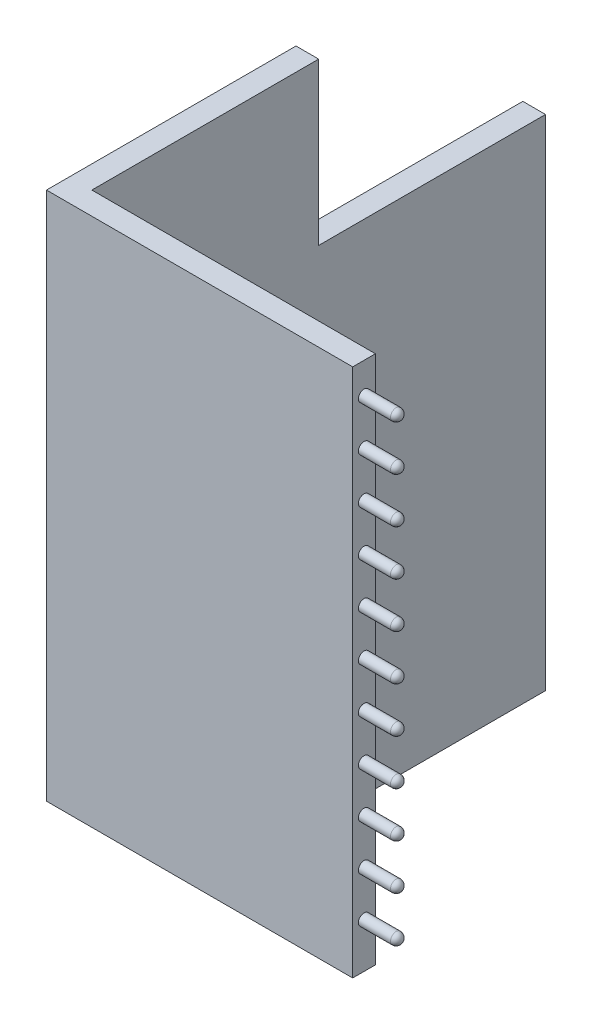
ISO-10303-21;
HEADER;
FILE_DESCRIPTION(('STEP AP214'),'2;1');
FILE_NAME('part.step','',(''),(''),'','','');
FILE_SCHEMA(('AUTOMOTIVE_DESIGN { 1 0 10303 214 1 1 1 1 }'));
ENDSEC;
DATA;
#1=APPLICATION_CONTEXT('core data for automotive mechanical design processes');
#2=APPLICATION_PROTOCOL_DEFINITION('international standard','automotive_design',2000,#1);
#3=PRODUCT_CONTEXT('',#1,'mechanical');
#4=PRODUCT('Part','Part','',(#3));
#5=PRODUCT_RELATED_PRODUCT_CATEGORY('part','',(#4));
#6=PRODUCT_DEFINITION_FORMATION('','',#4);
#7=PRODUCT_DEFINITION_CONTEXT('part definition',#1,'design');
#8=PRODUCT_DEFINITION('design','',#6,#7);
#9=PRODUCT_DEFINITION_SHAPE('','',#8);
#10=(LENGTH_UNIT() NAMED_UNIT(*) SI_UNIT(.MILLI.,.METRE.));
#11=(NAMED_UNIT(*) PLANE_ANGLE_UNIT() SI_UNIT($,.RADIAN.));
#12=(NAMED_UNIT(*) SI_UNIT($,.STERADIAN.) SOLID_ANGLE_UNIT());
#13=UNCERTAINTY_MEASURE_WITH_UNIT(LENGTH_MEASURE(1.E-05),#10,'distance_accuracy_value','');
#14=(GEOMETRIC_REPRESENTATION_CONTEXT(3) GLOBAL_UNCERTAINTY_ASSIGNED_CONTEXT((#13)) GLOBAL_UNIT_ASSIGNED_CONTEXT((#10,
#11,#12)) REPRESENTATION_CONTEXT('',''));
#15=CARTESIAN_POINT('',(0.,0.,0.));
#16=DIRECTION('',(0.,0.,1.));
#17=DIRECTION('',(1.,0.,0.));
#18=AXIS2_PLACEMENT_3D('',#15,#16,#17);
#19=CARTESIAN_POINT('',(0.,0.,-30.));
#20=DIRECTION('',(0.,0.,1.));
#21=DIRECTION('',(1.,0.,0.));
#22=AXIS2_PLACEMENT_3D('',#19,#20,#21);
#23=PLANE('',#22);
#24=DIRECTION('',(1.,0.,0.));
#25=VECTOR('',#24,1.);
#26=CARTESIAN_POINT('',(-20.25,13.66,-30.));
#27=LINE('',#26,#25);
#28=CARTESIAN_POINT('',(-20.25,13.66,-30.));
#29=VERTEX_POINT('',#28);
#30=CARTESIAN_POINT('',(-17.25,13.66,-30.));
#31=VERTEX_POINT('',#30);
#32=EDGE_CURVE('E63',#29,#31,#27,.T.);
#33=ORIENTED_EDGE('',*,*,#32,.F.);
#34=DIRECTION('',(0.,1.,0.));
#35=VECTOR('',#34,1.);
#36=CARTESIAN_POINT('',(-20.25,35.,-30.));
#37=LINE('',#36,#35);
#38=CARTESIAN_POINT('',(-20.25,35.,-30.));
#39=VERTEX_POINT('',#38);
#40=EDGE_CURVE('E190',#29,#39,#37,.T.);
#41=ORIENTED_EDGE('',*,*,#40,.T.);
#42=DIRECTION('',(1.,0.,0.));
#43=VECTOR('',#42,1.);
#44=CARTESIAN_POINT('',(-20.25,35.,-30.));
#45=LINE('',#44,#43);
#46=CARTESIAN_POINT('',(-17.25,35.,-30.));
#47=VERTEX_POINT('',#46);
#48=EDGE_CURVE('E193',#39,#47,#45,.T.);
#49=ORIENTED_EDGE('',*,*,#48,.T.);
#50=DIRECTION('',(0.,-1.,0.));
#51=VECTOR('',#50,1.);
#52=CARTESIAN_POINT('',(-17.25,35.,-30.));
#53=LINE('',#52,#51);
#54=EDGE_CURVE('E196',#47,#31,#53,.T.);
#55=ORIENTED_EDGE('',*,*,#54,.T.);
#56=EDGE_LOOP('',(#33,#41,#49,#55));
#57=FACE_BOUND('',#56,.T.);
#58=ADVANCED_FACE('F47',(#57),#23,.F.);
#59=CARTESIAN_POINT('',(-20.25,35.,3.));
#60=DIRECTION('',(1.,0.,0.));
#61=DIRECTION('',(0.,1.,0.));
#62=AXIS2_PLACEMENT_3D('',#59,#60,#61);
#63=PLANE('',#62);
#64=DIRECTION('',(0.,0.,-1.));
#65=VECTOR('',#64,1.);
#66=CARTESIAN_POINT('',(-20.25,35.,3.));
#67=LINE('',#66,#65);
#68=CARTESIAN_POINT('',(-20.25,35.,3.));
#69=VERTEX_POINT('',#68);
#70=EDGE_CURVE('E226',#69,#39,#67,.T.);
#71=ORIENTED_EDGE('',*,*,#70,.T.);
#72=ORIENTED_EDGE('',*,*,#40,.F.);
#73=DIRECTION('',(0.,0.,1.));
#74=VECTOR('',#73,1.);
#75=CARTESIAN_POINT('',(-20.25,13.66,-30.));
#76=LINE('',#75,#74);
#77=CARTESIAN_POINT('',(-20.25,13.66,-60.));
#78=VERTEX_POINT('',#77);
#79=EDGE_CURVE('E149',#78,#29,#76,.T.);
#80=ORIENTED_EDGE('',*,*,#79,.F.);
#81=DIRECTION('',(0.,1.,0.));
#82=VECTOR('',#81,1.);
#83=CARTESIAN_POINT('',(-20.25,13.66,-60.));
#84=LINE('',#83,#82);
#85=CARTESIAN_POINT('',(-20.25,-52.34,-60.));
#86=VERTEX_POINT('',#85);
#87=EDGE_CURVE('E156',#86,#78,#84,.T.);
#88=ORIENTED_EDGE('',*,*,#87,.F.);
#89=DIRECTION('',(0.,0.,-1.));
#90=VECTOR('',#89,1.);
#91=CARTESIAN_POINT('',(-20.25,-52.34,-30.));
#92=LINE('',#91,#90);
#93=CARTESIAN_POINT('',(-20.25,-52.34,-30.));
#94=VERTEX_POINT('',#93);
#95=EDGE_CURVE('E139',#94,#86,#92,.T.);
#96=ORIENTED_EDGE('',*,*,#95,.F.);
#97=DIRECTION('',(0.,-1.,0.));
#98=VECTOR('',#97,1.);
#99=CARTESIAN_POINT('',(-20.25,13.66,-30.));
#100=LINE('',#99,#98);
#101=CARTESIAN_POINT('',(-20.25,-35.,-30.));
#102=VERTEX_POINT('',#101);
#103=EDGE_CURVE('E127',#102,#94,#100,.T.);
#104=ORIENTED_EDGE('',*,*,#103,.F.);
#105=DIRECTION('',(0.,0.,-1.));
#106=VECTOR('',#105,1.);
#107=CARTESIAN_POINT('',(-20.25,-35.,3.));
#108=LINE('',#107,#106);
#109=CARTESIAN_POINT('',(-20.25,-35.,3.));
#110=VERTEX_POINT('',#109);
#111=EDGE_CURVE('E244',#110,#102,#108,.T.);
#112=ORIENTED_EDGE('',*,*,#111,.F.);
#113=DIRECTION('',(0.,-1.,0.));
#114=VECTOR('',#113,1.);
#115=CARTESIAN_POINT('',(-20.25,35.,3.));
#116=LINE('',#115,#114);
#117=EDGE_CURVE('E212',#69,#110,#116,.T.);
#118=ORIENTED_EDGE('',*,*,#117,.F.);
#119=EDGE_LOOP('',(#71,#72,#80,#88,#96,#104,#112,#118));
#120=FACE_BOUND('',#119,.T.);
#121=ADVANCED_FACE('F153',(#120),#63,.F.);
#122=CARTESIAN_POINT('',(20.25,-35.,3.));
#123=DIRECTION('',(0.,1.,0.));
#124=DIRECTION('',(-1.,0.,0.));
#125=AXIS2_PLACEMENT_3D('',#122,#123,#124);
#126=PLANE('',#125);
#127=ORIENTED_EDGE('',*,*,#111,.T.);
#128=DIRECTION('',(-1.,0.,0.));
#129=VECTOR('',#128,1.);
#130=CARTESIAN_POINT('',(-20.25,-35.,-30.));
#131=LINE('',#130,#129);
#132=CARTESIAN_POINT('',(-17.25,-35.,-30.));
#133=VERTEX_POINT('',#132);
#134=EDGE_CURVE('E134',#133,#102,#131,.T.);
#135=ORIENTED_EDGE('',*,*,#134,.F.);
#136=DIRECTION('',(0.,0.,1.));
#137=VECTOR('',#136,1.);
#138=CARTESIAN_POINT('',(-17.25,-35.,-30.));
#139=LINE('',#138,#137);
#140=CARTESIAN_POINT('',(-17.25,-35.,0.));
#141=VERTEX_POINT('',#140);
#142=EDGE_CURVE('E201',#133,#141,#139,.T.);
#143=ORIENTED_EDGE('',*,*,#142,.T.);
#144=DIRECTION('',(1.,0.,0.));
#145=VECTOR('',#144,1.);
#146=CARTESIAN_POINT('',(20.25,-35.,0.));
#147=LINE('',#146,#145);
#148=CARTESIAN_POINT('',(20.25,-35.,0.));
#149=VERTEX_POINT('',#148);
#150=EDGE_CURVE('E211',#141,#149,#147,.T.);
#151=ORIENTED_EDGE('',*,*,#150,.T.);
#152=DIRECTION('',(0.,0.,-1.));
#153=VECTOR('',#152,1.);
#154=CARTESIAN_POINT('',(20.25,-35.,3.));
#155=LINE('',#154,#153);
#156=CARTESIAN_POINT('',(20.25,-35.,3.));
#157=VERTEX_POINT('',#156);
#158=EDGE_CURVE('E240',#157,#149,#155,.T.);
#159=ORIENTED_EDGE('',*,*,#158,.F.);
#160=DIRECTION('',(1.,0.,0.));
#161=VECTOR('',#160,1.);
#162=CARTESIAN_POINT('',(20.25,-35.,3.));
#163=LINE('',#162,#161);
#164=EDGE_CURVE('E216',#110,#157,#163,.T.);
#165=ORIENTED_EDGE('',*,*,#164,.F.);
#166=EDGE_LOOP('',(#127,#135,#143,#151,#159,#165));
#167=FACE_BOUND('',#166,.T.);
#168=ADVANCED_FACE('F343',(#167),#126,.F.);
#169=CARTESIAN_POINT('',(20.25,35.,3.));
#170=DIRECTION('',(-1.,0.,0.));
#171=DIRECTION('',(0.,-1.,0.));
#172=AXIS2_PLACEMENT_3D('',#169,#170,#171);
#173=PLANE('',#172);
#174=CARTESIAN_POINT('',(20.25,-5.04310615896624,1.49999999999963));
#175=DIRECTION('',(1.,0.,0.));
#176=DIRECTION('',(0.,1.,0.));
#177=AXIS2_PLACEMENT_3D('',#174,#175,#176);
#178=CIRCLE('',#177,0.75);
#179=CARTESIAN_POINT('',(20.25,-4.29310615896624,1.49999999999963));
#180=VERTEX_POINT('',#179);
#181=EDGE_CURVE('E184',#180,#180,#178,.T.);
#182=ORIENTED_EDGE('',*,*,#181,.F.);
#183=EDGE_LOOP('',(#182));
#184=FACE_BOUND('',#183,.T.);
#185=CARTESIAN_POINT('',(20.25,30.9568938410338,1.5));
#186=DIRECTION('',(-1.,0.,0.));
#187=DIRECTION('',(0.,-1.,0.));
#188=AXIS2_PLACEMENT_3D('',#185,#186,#187);
#189=CIRCLE('',#188,0.75);
#190=CARTESIAN_POINT('',(20.25,30.2068938410338,1.5));
#191=VERTEX_POINT('',#190);
#192=EDGE_CURVE('E189',#191,#191,#189,.F.);
#193=ORIENTED_EDGE('',*,*,#192,.F.);
#194=EDGE_LOOP('',(#193));
#195=FACE_BOUND('',#194,.T.);
#196=CARTESIAN_POINT('',(20.25,24.9568938410338,1.49999999999994));
#197=DIRECTION('',(-1.,0.,0.));
#198=DIRECTION('',(0.,-1.,0.));
#199=AXIS2_PLACEMENT_3D('',#196,#197,#198);
#200=CIRCLE('',#199,0.75);
#201=CARTESIAN_POINT('',(20.25,24.2068938410338,1.49999999999994));
#202=VERTEX_POINT('',#201);
#203=EDGE_CURVE('E279',#202,#202,#200,.F.);
#204=ORIENTED_EDGE('',*,*,#203,.F.);
#205=EDGE_LOOP('',(#204));
#206=FACE_BOUND('',#205,.T.);
#207=CARTESIAN_POINT('',(20.25,18.9568938410338,1.49999999999988));
#208=DIRECTION('',(-1.,0.,0.));
#209=DIRECTION('',(0.,-1.,0.));
#210=AXIS2_PLACEMENT_3D('',#207,#208,#209);
#211=CIRCLE('',#210,0.75);
#212=CARTESIAN_POINT('',(20.25,18.2068938410338,1.49999999999988));
#213=VERTEX_POINT('',#212);
#214=EDGE_CURVE('E275',#213,#213,#211,.F.);
#215=ORIENTED_EDGE('',*,*,#214,.F.);
#216=EDGE_LOOP('',(#215));
#217=FACE_BOUND('',#216,.T.);
#218=CARTESIAN_POINT('',(20.25,12.9568938410338,1.49999999999981));
#219=DIRECTION('',(-1.,0.,0.));
#220=DIRECTION('',(0.,-1.,0.));
#221=AXIS2_PLACEMENT_3D('',#218,#219,#220);
#222=CIRCLE('',#221,0.75);
#223=CARTESIAN_POINT('',(20.25,12.2068938410338,1.49999999999981));
#224=VERTEX_POINT('',#223);
#225=EDGE_CURVE('E271',#224,#224,#222,.F.);
#226=ORIENTED_EDGE('',*,*,#225,.F.);
#227=EDGE_LOOP('',(#226));
#228=FACE_BOUND('',#227,.T.);
#229=CARTESIAN_POINT('',(20.25,6.95689384103377,1.49999999999975));
#230=DIRECTION('',(-1.,0.,0.));
#231=DIRECTION('',(0.,-1.,0.));
#232=AXIS2_PLACEMENT_3D('',#229,#230,#231);
#233=CIRCLE('',#232,0.75);
#234=CARTESIAN_POINT('',(20.25,6.20689384103377,1.49999999999975));
#235=VERTEX_POINT('',#234);
#236=EDGE_CURVE('E267',#235,#235,#233,.F.);
#237=ORIENTED_EDGE('',*,*,#236,.F.);
#238=EDGE_LOOP('',(#237));
#239=FACE_BOUND('',#238,.T.);
#240=CARTESIAN_POINT('',(20.25,0.956893841033769,1.49999999999969));
#241=DIRECTION('',(-1.,0.,0.));
#242=DIRECTION('',(0.,-1.,0.));
#243=AXIS2_PLACEMENT_3D('',#240,#241,#242);
#244=CIRCLE('',#243,0.75);
#245=CARTESIAN_POINT('',(20.25,0.206893841033769,1.49999999999969));
#246=VERTEX_POINT('',#245);
#247=EDGE_CURVE('E263',#246,#246,#244,.F.);
#248=ORIENTED_EDGE('',*,*,#247,.F.);
#249=EDGE_LOOP('',(#248));
#250=FACE_BOUND('',#249,.T.);
#251=CARTESIAN_POINT('',(20.25,-11.0431061589662,1.49999999999956));
#252=DIRECTION('',(-1.,0.,0.));
#253=DIRECTION('',(0.,-1.,0.));
#254=AXIS2_PLACEMENT_3D('',#251,#252,#253);
#255=CIRCLE('',#254,0.75);
#256=CARTESIAN_POINT('',(20.25,-11.7931061589662,1.49999999999956));
#257=VERTEX_POINT('',#256);
#258=EDGE_CURVE('E259',#257,#257,#255,.F.);
#259=ORIENTED_EDGE('',*,*,#258,.F.);
#260=EDGE_LOOP('',(#259));
#261=FACE_BOUND('',#260,.T.);
#262=CARTESIAN_POINT('',(20.25,-17.0431061589662,1.4999999999995));
#263=DIRECTION('',(-1.,0.,0.));
#264=DIRECTION('',(0.,-1.,0.));
#265=AXIS2_PLACEMENT_3D('',#262,#263,#264);
#266=CIRCLE('',#265,0.75);
#267=CARTESIAN_POINT('',(20.25,-17.7931061589662,1.4999999999995));
#268=VERTEX_POINT('',#267);
#269=EDGE_CURVE('E255',#268,#268,#266,.F.);
#270=ORIENTED_EDGE('',*,*,#269,.F.);
#271=EDGE_LOOP('',(#270));
#272=FACE_BOUND('',#271,.T.);
#273=CARTESIAN_POINT('',(20.25,-23.0431061589662,1.49999999999944));
#274=DIRECTION('',(-1.,0.,0.));
#275=DIRECTION('',(0.,-1.,0.));
#276=AXIS2_PLACEMENT_3D('',#273,#274,#275);
#277=CIRCLE('',#276,0.75);
#278=CARTESIAN_POINT('',(20.25,-23.7931061589662,1.49999999999944));
#279=VERTEX_POINT('',#278);
#280=EDGE_CURVE('E251',#279,#279,#277,.F.);
#281=ORIENTED_EDGE('',*,*,#280,.F.);
#282=EDGE_LOOP('',(#281));
#283=FACE_BOUND('',#282,.T.);
#284=CARTESIAN_POINT('',(20.25,-29.0431061589662,1.49999999999938));
#285=DIRECTION('',(-1.,0.,0.));
#286=DIRECTION('',(0.,-1.,0.));
#287=AXIS2_PLACEMENT_3D('',#284,#285,#286);
#288=CIRCLE('',#287,0.75);
#289=CARTESIAN_POINT('',(20.25,-29.7931061589662,1.49999999999938));
#290=VERTEX_POINT('',#289);
#291=EDGE_CURVE('E247',#290,#290,#288,.F.);
#292=ORIENTED_EDGE('',*,*,#291,.F.);
#293=EDGE_LOOP('',(#292));
#294=FACE_BOUND('',#293,.T.);
#295=DIRECTION('',(0.,1.,0.));
#296=VECTOR('',#295,1.);
#297=CARTESIAN_POINT('',(20.25,35.,0.));
#298=LINE('',#297,#296);
#299=CARTESIAN_POINT('',(20.25,35.,0.));
#300=VERTEX_POINT('',#299);
#301=EDGE_CURVE('E229',#149,#300,#298,.T.);
#302=ORIENTED_EDGE('',*,*,#301,.T.);
#303=DIRECTION('',(0.,0.,-1.));
#304=VECTOR('',#303,1.);
#305=CARTESIAN_POINT('',(20.25,35.,3.));
#306=LINE('',#305,#304);
#307=CARTESIAN_POINT('',(20.25,35.,3.));
#308=VERTEX_POINT('',#307);
#309=EDGE_CURVE('E236',#308,#300,#306,.T.);
#310=ORIENTED_EDGE('',*,*,#309,.F.);
#311=DIRECTION('',(0.,1.,0.));
#312=VECTOR('',#311,1.);
#313=CARTESIAN_POINT('',(20.25,35.,3.));
#314=LINE('',#313,#312);
#315=EDGE_CURVE('E220',#157,#308,#314,.T.);
#316=ORIENTED_EDGE('',*,*,#315,.F.);
#317=ORIENTED_EDGE('',*,*,#158,.T.);
#318=EDGE_LOOP('',(#302,#310,#316,#317));
#319=FACE_BOUND('',#318,.T.);
#320=ADVANCED_FACE('F363',(#184,#195,#206,#217,#228,#239,#250,#261,#272,#283,#294,#319),#173,.F.);
#321=CARTESIAN_POINT('',(20.25,35.,3.));
#322=DIRECTION('',(0.,-1.,0.));
#323=DIRECTION('',(1.,0.,0.));
#324=AXIS2_PLACEMENT_3D('',#321,#322,#323);
#325=PLANE('',#324);
#326=DIRECTION('',(-1.,0.,0.));
#327=VECTOR('',#326,1.);
#328=CARTESIAN_POINT('',(20.25,35.,0.));
#329=LINE('',#328,#327);
#330=CARTESIAN_POINT('',(-17.25,35.,0.));
#331=VERTEX_POINT('',#330);
#332=EDGE_CURVE('E217',#300,#331,#329,.T.);
#333=ORIENTED_EDGE('',*,*,#332,.T.);
#334=DIRECTION('',(0.,0.,1.));
#335=VECTOR('',#334,1.);
#336=CARTESIAN_POINT('',(-17.25,35.,-30.));
#337=LINE('',#336,#335);
#338=EDGE_CURVE('E207',#47,#331,#337,.T.);
#339=ORIENTED_EDGE('',*,*,#338,.F.);
#340=ORIENTED_EDGE('',*,*,#48,.F.);
#341=ORIENTED_EDGE('',*,*,#70,.F.);
#342=DIRECTION('',(-1.,0.,0.));
#343=VECTOR('',#342,1.);
#344=CARTESIAN_POINT('',(20.25,35.,3.));
#345=LINE('',#344,#343);
#346=EDGE_CURVE('E223',#308,#69,#345,.T.);
#347=ORIENTED_EDGE('',*,*,#346,.F.);
#348=ORIENTED_EDGE('',*,*,#309,.T.);
#349=EDGE_LOOP('',(#333,#339,#340,#341,#347,#348));
#350=FACE_BOUND('',#349,.T.);
#351=ADVANCED_FACE('F357',(#350),#325,.F.);
#352=CARTESIAN_POINT('',(0.,0.,3.));
#353=DIRECTION('',(0.,0.,-1.));
#354=DIRECTION('',(-1.,0.,0.));
#355=AXIS2_PLACEMENT_3D('',#352,#353,#354);
#356=PLANE('',#355);
#357=ORIENTED_EDGE('',*,*,#117,.T.);
#358=ORIENTED_EDGE('',*,*,#164,.T.);
#359=ORIENTED_EDGE('',*,*,#315,.T.);
#360=ORIENTED_EDGE('',*,*,#346,.T.);
#361=EDGE_LOOP('',(#357,#358,#359,#360));
#362=FACE_BOUND('',#361,.T.);
#363=ADVANCED_FACE('F354',(#362),#356,.F.);
#364=CARTESIAN_POINT('',(0.,0.,0.));
#365=DIRECTION('',(0.,0.,-1.));
#366=DIRECTION('',(-1.,0.,0.));
#367=AXIS2_PLACEMENT_3D('',#364,#365,#366);
#368=PLANE('',#367);
#369=DIRECTION('',(0.,-1.,0.));
#370=VECTOR('',#369,1.);
#371=CARTESIAN_POINT('',(-17.25,35.,0.));
#372=LINE('',#371,#370);
#373=EDGE_CURVE('E71',#331,#141,#372,.T.);
#374=ORIENTED_EDGE('',*,*,#373,.F.);
#375=ORIENTED_EDGE('',*,*,#332,.F.);
#376=ORIENTED_EDGE('',*,*,#301,.F.);
#377=ORIENTED_EDGE('',*,*,#150,.F.);
#378=EDGE_LOOP('',(#374,#375,#376,#377));
#379=FACE_BOUND('',#378,.T.);
#380=ADVANCED_FACE('F352',(#379),#368,.T.);
#381=CARTESIAN_POINT('',(-17.25,35.,-30.));
#382=DIRECTION('',(-1.,0.,0.));
#383=DIRECTION('',(0.,-1.,0.));
#384=AXIS2_PLACEMENT_3D('',#381,#382,#383);
#385=PLANE('',#384);
#386=ORIENTED_EDGE('',*,*,#373,.T.);
#387=ORIENTED_EDGE('',*,*,#142,.F.);
#388=DIRECTION('',(0.,-1.,0.));
#389=VECTOR('',#388,1.);
#390=CARTESIAN_POINT('',(-17.25,13.66,-30.));
#391=LINE('',#390,#389);
#392=CARTESIAN_POINT('',(-17.25,-52.34,-30.));
#393=VERTEX_POINT('',#392);
#394=EDGE_CURVE('E165',#133,#393,#391,.T.);
#395=ORIENTED_EDGE('',*,*,#394,.T.);
#396=DIRECTION('',(0.,0.,-1.));
#397=VECTOR('',#396,1.);
#398=CARTESIAN_POINT('',(-17.25,-52.34,-30.));
#399=LINE('',#398,#397);
#400=CARTESIAN_POINT('',(-17.25,-52.34,-60.));
#401=VERTEX_POINT('',#400);
#402=EDGE_CURVE('E146',#393,#401,#399,.T.);
#403=ORIENTED_EDGE('',*,*,#402,.T.);
#404=DIRECTION('',(0.,1.,0.));
#405=VECTOR('',#404,1.);
#406=CARTESIAN_POINT('',(-17.25,13.66,-60.));
#407=LINE('',#406,#405);
#408=CARTESIAN_POINT('',(-17.25,13.66,-60.));
#409=VERTEX_POINT('',#408);
#410=EDGE_CURVE('E170',#401,#409,#407,.T.);
#411=ORIENTED_EDGE('',*,*,#410,.T.);
#412=DIRECTION('',(0.,0.,1.));
#413=VECTOR('',#412,1.);
#414=CARTESIAN_POINT('',(-17.25,13.66,-30.));
#415=LINE('',#414,#413);
#416=EDGE_CURVE('E140',#409,#31,#415,.T.);
#417=ORIENTED_EDGE('',*,*,#416,.T.);
#418=ORIENTED_EDGE('',*,*,#54,.F.);
#419=ORIENTED_EDGE('',*,*,#338,.T.);
#420=EDGE_LOOP('',(#386,#387,#395,#403,#411,#417,#418,#419));
#421=FACE_BOUND('',#420,.T.);
#422=ADVANCED_FACE('F349',(#421),#385,.F.);
#423=CARTESIAN_POINT('',(25.25,-29.0431061589662,1.49999999999938));
#424=DIRECTION('',(-1.,0.,0.));
#425=DIRECTION('',(0.,-1.,0.));
#426=AXIS2_PLACEMENT_3D('',#423,#424,#425);
#427=CYLINDRICAL_SURFACE('',#426,0.75);
#428=CARTESIAN_POINT('',(24.5,-29.0431061589662,1.49999999999938));
#429=DIRECTION('',(-1.,0.,0.));
#430=DIRECTION('',(0.,-1.,0.));
#431=AXIS2_PLACEMENT_3D('',#428,#429,#430);
#432=CIRCLE('',#431,0.75);
#433=CARTESIAN_POINT('',(24.5,-29.7931061589662,1.49999999999938));
#434=VERTEX_POINT('',#433);
#435=EDGE_CURVE('E188',#434,#434,#432,.T.);
#436=ORIENTED_EDGE('',*,*,#435,.T.);
#437=EDGE_LOOP('',(#436));
#438=FACE_BOUND('',#437,.T.);
#439=ORIENTED_EDGE('',*,*,#291,.T.);
#440=EDGE_LOOP('',(#439));
#441=FACE_BOUND('',#440,.T.);
#442=ADVANCED_FACE('F347',(#438,#441),#427,.T.);
#443=CARTESIAN_POINT('',(25.25,-23.0431061589662,1.49999999999944));
#444=DIRECTION('',(-1.,0.,0.));
#445=DIRECTION('',(0.,-1.,0.));
#446=AXIS2_PLACEMENT_3D('',#443,#444,#445);
#447=CYLINDRICAL_SURFACE('',#446,0.75);
#448=CARTESIAN_POINT('',(24.5,-23.0431061589662,1.49999999999944));
#449=DIRECTION('',(-1.,0.,0.));
#450=DIRECTION('',(0.,-1.,0.));
#451=AXIS2_PLACEMENT_3D('',#448,#449,#450);
#452=CIRCLE('',#451,0.75);
#453=CARTESIAN_POINT('',(24.5,-23.7931061589662,1.49999999999944));
#454=VERTEX_POINT('',#453);
#455=EDGE_CURVE('E289',#454,#454,#452,.T.);
#456=ORIENTED_EDGE('',*,*,#455,.T.);
#457=EDGE_LOOP('',(#456));
#458=FACE_BOUND('',#457,.T.);
#459=ORIENTED_EDGE('',*,*,#280,.T.);
#460=EDGE_LOOP('',(#459));
#461=FACE_BOUND('',#460,.T.);
#462=ADVANCED_FACE('F479',(#458,#461),#447,.T.);
#463=CARTESIAN_POINT('',(25.25,-17.0431061589662,1.4999999999995));
#464=DIRECTION('',(-1.,0.,0.));
#465=DIRECTION('',(0.,-1.,0.));
#466=AXIS2_PLACEMENT_3D('',#463,#464,#465);
#467=CYLINDRICAL_SURFACE('',#466,0.75);
#468=CARTESIAN_POINT('',(24.5,-17.0431061589662,1.4999999999995));
#469=DIRECTION('',(-1.,0.,0.));
#470=DIRECTION('',(0.,-1.,0.));
#471=AXIS2_PLACEMENT_3D('',#468,#469,#470);
#472=CIRCLE('',#471,0.75);
#473=CARTESIAN_POINT('',(24.5,-17.7931061589662,1.4999999999995));
#474=VERTEX_POINT('',#473);
#475=EDGE_CURVE('E293',#474,#474,#472,.T.);
#476=ORIENTED_EDGE('',*,*,#475,.T.);
#477=EDGE_LOOP('',(#476));
#478=FACE_BOUND('',#477,.T.);
#479=ORIENTED_EDGE('',*,*,#269,.T.);
#480=EDGE_LOOP('',(#479));
#481=FACE_BOUND('',#480,.T.);
#482=ADVANCED_FACE('F476',(#478,#481),#467,.T.);
#483=CARTESIAN_POINT('',(25.25,-11.0431061589662,1.49999999999956));
#484=DIRECTION('',(-1.,0.,0.));
#485=DIRECTION('',(0.,-1.,0.));
#486=AXIS2_PLACEMENT_3D('',#483,#484,#485);
#487=CYLINDRICAL_SURFACE('',#486,0.75);
#488=CARTESIAN_POINT('',(24.5,-11.0431061589662,1.49999999999956));
#489=DIRECTION('',(-1.,0.,0.));
#490=DIRECTION('',(0.,-1.,0.));
#491=AXIS2_PLACEMENT_3D('',#488,#489,#490);
#492=CIRCLE('',#491,0.75);
#493=CARTESIAN_POINT('',(24.5,-11.7931061589662,1.49999999999956));
#494=VERTEX_POINT('',#493);
#495=EDGE_CURVE('E297',#494,#494,#492,.T.);
#496=ORIENTED_EDGE('',*,*,#495,.T.);
#497=EDGE_LOOP('',(#496));
#498=FACE_BOUND('',#497,.T.);
#499=ORIENTED_EDGE('',*,*,#258,.T.);
#500=EDGE_LOOP('',(#499));
#501=FACE_BOUND('',#500,.T.);
#502=ADVANCED_FACE('F469',(#498,#501),#487,.T.);
#503=CARTESIAN_POINT('',(25.25,0.95689384103377,1.49999999999969));
#504=DIRECTION('',(-1.,0.,0.));
#505=DIRECTION('',(0.,-1.,0.));
#506=AXIS2_PLACEMENT_3D('',#503,#504,#505);
#507=CYLINDRICAL_SURFACE('',#506,0.75);
#508=CARTESIAN_POINT('',(24.5,0.95689384103377,1.49999999999969));
#509=DIRECTION('',(-1.,0.,0.));
#510=DIRECTION('',(0.,-1.,0.));
#511=AXIS2_PLACEMENT_3D('',#508,#509,#510);
#512=CIRCLE('',#511,0.75);
#513=CARTESIAN_POINT('',(24.5,0.20689384103377,1.49999999999969));
#514=VERTEX_POINT('',#513);
#515=EDGE_CURVE('E305',#514,#514,#512,.T.);
#516=ORIENTED_EDGE('',*,*,#515,.T.);
#517=EDGE_LOOP('',(#516));
#518=FACE_BOUND('',#517,.T.);
#519=ORIENTED_EDGE('',*,*,#247,.T.);
#520=EDGE_LOOP('',(#519));
#521=FACE_BOUND('',#520,.T.);
#522=ADVANCED_FACE('F465',(#518,#521),#507,.T.);
#523=CARTESIAN_POINT('',(25.25,6.95689384103377,1.49999999999975));
#524=DIRECTION('',(-1.,0.,0.));
#525=DIRECTION('',(0.,-1.,0.));
#526=AXIS2_PLACEMENT_3D('',#523,#524,#525);
#527=CYLINDRICAL_SURFACE('',#526,0.75);
#528=CARTESIAN_POINT('',(24.5,6.95689384103377,1.49999999999975));
#529=DIRECTION('',(-1.,0.,0.));
#530=DIRECTION('',(0.,-1.,0.));
#531=AXIS2_PLACEMENT_3D('',#528,#529,#530);
#532=CIRCLE('',#531,0.75);
#533=CARTESIAN_POINT('',(24.5,6.20689384103377,1.49999999999975));
#534=VERTEX_POINT('',#533);
#535=EDGE_CURVE('E309',#534,#534,#532,.T.);
#536=ORIENTED_EDGE('',*,*,#535,.T.);
#537=EDGE_LOOP('',(#536));
#538=FACE_BOUND('',#537,.T.);
#539=ORIENTED_EDGE('',*,*,#236,.T.);
#540=EDGE_LOOP('',(#539));
#541=FACE_BOUND('',#540,.T.);
#542=ADVANCED_FACE('F410',(#538,#541),#527,.T.);
#543=CARTESIAN_POINT('',(25.25,12.9568938410338,1.49999999999981));
#544=DIRECTION('',(-1.,0.,0.));
#545=DIRECTION('',(0.,-1.,0.));
#546=AXIS2_PLACEMENT_3D('',#543,#544,#545);
#547=CYLINDRICAL_SURFACE('',#546,0.75);
#548=CARTESIAN_POINT('',(24.5,12.9568938410338,1.49999999999981));
#549=DIRECTION('',(-1.,0.,0.));
#550=DIRECTION('',(0.,-1.,0.));
#551=AXIS2_PLACEMENT_3D('',#548,#549,#550);
#552=CIRCLE('',#551,0.75);
#553=CARTESIAN_POINT('',(24.5,12.2068938410338,1.49999999999981));
#554=VERTEX_POINT('',#553);
#555=EDGE_CURVE('E313',#554,#554,#552,.T.);
#556=ORIENTED_EDGE('',*,*,#555,.T.);
#557=EDGE_LOOP('',(#556));
#558=FACE_BOUND('',#557,.T.);
#559=ORIENTED_EDGE('',*,*,#225,.T.);
#560=EDGE_LOOP('',(#559));
#561=FACE_BOUND('',#560,.T.);
#562=ADVANCED_FACE('F406',(#558,#561),#547,.T.);
#563=CARTESIAN_POINT('',(25.25,18.9568938410338,1.49999999999988));
#564=DIRECTION('',(-1.,0.,0.));
#565=DIRECTION('',(0.,-1.,0.));
#566=AXIS2_PLACEMENT_3D('',#563,#564,#565);
#567=CYLINDRICAL_SURFACE('',#566,0.75);
#568=CARTESIAN_POINT('',(24.5,18.9568938410338,1.49999999999988));
#569=DIRECTION('',(-1.,0.,0.));
#570=DIRECTION('',(0.,-1.,0.));
#571=AXIS2_PLACEMENT_3D('',#568,#569,#570);
#572=CIRCLE('',#571,0.75);
#573=CARTESIAN_POINT('',(24.5,18.2068938410338,1.49999999999988));
#574=VERTEX_POINT('',#573);
#575=EDGE_CURVE('E317',#574,#574,#572,.T.);
#576=ORIENTED_EDGE('',*,*,#575,.T.);
#577=EDGE_LOOP('',(#576));
#578=FACE_BOUND('',#577,.T.);
#579=ORIENTED_EDGE('',*,*,#214,.T.);
#580=EDGE_LOOP('',(#579));
#581=FACE_BOUND('',#580,.T.);
#582=ADVANCED_FACE('F409',(#578,#581),#567,.T.);
#583=CARTESIAN_POINT('',(25.25,24.9568938410338,1.49999999999994));
#584=DIRECTION('',(-1.,0.,0.));
#585=DIRECTION('',(0.,-1.,0.));
#586=AXIS2_PLACEMENT_3D('',#583,#584,#585);
#587=CYLINDRICAL_SURFACE('',#586,0.75);
#588=CARTESIAN_POINT('',(24.5,24.9568938410338,1.49999999999994));
#589=DIRECTION('',(-1.,0.,0.));
#590=DIRECTION('',(0.,-1.,0.));
#591=AXIS2_PLACEMENT_3D('',#588,#589,#590);
#592=CIRCLE('',#591,0.75);
#593=CARTESIAN_POINT('',(24.5,24.2068938410338,1.49999999999994));
#594=VERTEX_POINT('',#593);
#595=EDGE_CURVE('E56',#594,#594,#592,.T.);
#596=ORIENTED_EDGE('',*,*,#595,.T.);
#597=EDGE_LOOP('',(#596));
#598=FACE_BOUND('',#597,.T.);
#599=ORIENTED_EDGE('',*,*,#203,.T.);
#600=EDGE_LOOP('',(#599));
#601=FACE_BOUND('',#600,.T.);
#602=ADVANCED_FACE('F324',(#598,#601),#587,.T.);
#603=CARTESIAN_POINT('',(25.25,30.9568938410338,1.5));
#604=DIRECTION('',(-1.,0.,0.));
#605=DIRECTION('',(0.,-1.,0.));
#606=AXIS2_PLACEMENT_3D('',#603,#604,#605);
#607=CYLINDRICAL_SURFACE('',#606,0.75);
#608=CARTESIAN_POINT('',(24.5,30.9568938410338,1.5));
#609=DIRECTION('',(-1.,0.,0.));
#610=DIRECTION('',(0.,-1.,0.));
#611=AXIS2_PLACEMENT_3D('',#608,#609,#610);
#612=CIRCLE('',#611,0.75);
#613=CARTESIAN_POINT('',(24.5,30.2068938410338,1.5));
#614=VERTEX_POINT('',#613);
#615=EDGE_CURVE('E11',#614,#614,#612,.T.);
#616=ORIENTED_EDGE('',*,*,#615,.T.);
#617=EDGE_LOOP('',(#616));
#618=FACE_BOUND('',#617,.T.);
#619=ORIENTED_EDGE('',*,*,#192,.T.);
#620=EDGE_LOOP('',(#619));
#621=FACE_BOUND('',#620,.T.);
#622=ADVANCED_FACE('F454',(#618,#621),#607,.T.);
#623=CARTESIAN_POINT('',(25.25,-5.04310615896624,1.49999999999963));
#624=DIRECTION('',(-1.,0.,0.));
#625=DIRECTION('',(0.,-1.,0.));
#626=AXIS2_PLACEMENT_3D('',#623,#624,#625);
#627=CYLINDRICAL_SURFACE('',#626,0.75);
#628=CARTESIAN_POINT('',(24.5,-5.04310615896624,1.49999999999963));
#629=DIRECTION('',(-1.,0.,0.));
#630=DIRECTION('',(0.,-1.,0.));
#631=AXIS2_PLACEMENT_3D('',#628,#629,#630);
#632=CIRCLE('',#631,0.75);
#633=CARTESIAN_POINT('',(24.5,-5.79310615896624,1.49999999999963));
#634=VERTEX_POINT('',#633);
#635=EDGE_CURVE('E301',#634,#634,#632,.T.);
#636=ORIENTED_EDGE('',*,*,#635,.T.);
#637=EDGE_LOOP('',(#636));
#638=FACE_BOUND('',#637,.T.);
#639=ORIENTED_EDGE('',*,*,#181,.T.);
#640=EDGE_LOOP('',(#639));
#641=FACE_BOUND('',#640,.T.);
#642=ADVANCED_FACE('F375',(#638,#641),#627,.T.);
#643=CARTESIAN_POINT('',(24.5,-29.0431061589662,1.49999999999938));
#644=DIRECTION('',(1.,0.,0.));
#645=DIRECTION('',(0.,1.,0.));
#646=AXIS2_PLACEMENT_3D('',#643,#644,#645);
#647=SPHERICAL_SURFACE('',#646,0.75);
#648=ORIENTED_EDGE('',*,*,#435,.F.);
#649=EDGE_LOOP('',(#648));
#650=FACE_BOUND('',#649,.T.);
#651=ADVANCED_FACE('F371',(#650),#647,.T.);
#652=CARTESIAN_POINT('',(24.5,-23.0431061589662,1.49999999999944));
#653=DIRECTION('',(1.,0.,0.));
#654=DIRECTION('',(0.,1.,0.));
#655=AXIS2_PLACEMENT_3D('',#652,#653,#654);
#656=SPHERICAL_SURFACE('',#655,0.75);
#657=ORIENTED_EDGE('',*,*,#455,.F.);
#658=EDGE_LOOP('',(#657));
#659=FACE_BOUND('',#658,.T.);
#660=ADVANCED_FACE('F374',(#659),#656,.T.);
#661=CARTESIAN_POINT('',(24.5,-17.0431061589662,1.4999999999995));
#662=DIRECTION('',(1.,0.,0.));
#663=DIRECTION('',(0.,1.,0.));
#664=AXIS2_PLACEMENT_3D('',#661,#662,#663);
#665=SPHERICAL_SURFACE('',#664,0.75);
#666=ORIENTED_EDGE('',*,*,#475,.F.);
#667=EDGE_LOOP('',(#666));
#668=FACE_BOUND('',#667,.T.);
#669=ADVANCED_FACE('F379',(#668),#665,.T.);
#670=CARTESIAN_POINT('',(24.5,-11.0431061589662,1.49999999999956));
#671=DIRECTION('',(1.,0.,0.));
#672=DIRECTION('',(0.,1.,0.));
#673=AXIS2_PLACEMENT_3D('',#670,#671,#672);
#674=SPHERICAL_SURFACE('',#673,0.75);
#675=ORIENTED_EDGE('',*,*,#495,.F.);
#676=EDGE_LOOP('',(#675));
#677=FACE_BOUND('',#676,.T.);
#678=ADVANCED_FACE('F383',(#677),#674,.T.);
#679=CARTESIAN_POINT('',(24.5,-5.04310615896624,1.49999999999963));
#680=DIRECTION('',(1.,0.,0.));
#681=DIRECTION('',(0.,1.,0.));
#682=AXIS2_PLACEMENT_3D('',#679,#680,#681);
#683=SPHERICAL_SURFACE('',#682,0.75);
#684=ORIENTED_EDGE('',*,*,#635,.F.);
#685=EDGE_LOOP('',(#684));
#686=FACE_BOUND('',#685,.T.);
#687=ADVANCED_FACE('F387',(#686),#683,.T.);
#688=CARTESIAN_POINT('',(24.5,0.95689384103377,1.49999999999969));
#689=DIRECTION('',(1.,0.,0.));
#690=DIRECTION('',(0.,1.,0.));
#691=AXIS2_PLACEMENT_3D('',#688,#689,#690);
#692=SPHERICAL_SURFACE('',#691,0.75);
#693=ORIENTED_EDGE('',*,*,#515,.F.);
#694=EDGE_LOOP('',(#693));
#695=FACE_BOUND('',#694,.T.);
#696=ADVANCED_FACE('F391',(#695),#692,.T.);
#697=CARTESIAN_POINT('',(24.5,6.95689384103377,1.49999999999975));
#698=DIRECTION('',(1.,0.,0.));
#699=DIRECTION('',(0.,1.,0.));
#700=AXIS2_PLACEMENT_3D('',#697,#698,#699);
#701=SPHERICAL_SURFACE('',#700,0.75);
#702=ORIENTED_EDGE('',*,*,#535,.F.);
#703=EDGE_LOOP('',(#702));
#704=FACE_BOUND('',#703,.T.);
#705=ADVANCED_FACE('F395',(#704),#701,.T.);
#706=CARTESIAN_POINT('',(24.5,12.9568938410338,1.49999999999981));
#707=DIRECTION('',(1.,0.,0.));
#708=DIRECTION('',(0.,1.,0.));
#709=AXIS2_PLACEMENT_3D('',#706,#707,#708);
#710=SPHERICAL_SURFACE('',#709,0.75);
#711=ORIENTED_EDGE('',*,*,#555,.F.);
#712=EDGE_LOOP('',(#711));
#713=FACE_BOUND('',#712,.T.);
#714=ADVANCED_FACE('F335',(#713),#710,.T.);
#715=CARTESIAN_POINT('',(24.5,18.9568938410338,1.49999999999988));
#716=DIRECTION('',(1.,0.,0.));
#717=DIRECTION('',(0.,1.,0.));
#718=AXIS2_PLACEMENT_3D('',#715,#716,#717);
#719=SPHERICAL_SURFACE('',#718,0.75);
#720=ORIENTED_EDGE('',*,*,#575,.F.);
#721=EDGE_LOOP('',(#720));
#722=FACE_BOUND('',#721,.T.);
#723=ADVANCED_FACE('F329',(#722),#719,.T.);
#724=CARTESIAN_POINT('',(24.5,24.9568938410338,1.49999999999994));
#725=DIRECTION('',(1.,0.,0.));
#726=DIRECTION('',(0.,1.,0.));
#727=AXIS2_PLACEMENT_3D('',#724,#725,#726);
#728=SPHERICAL_SURFACE('',#727,0.75);
#729=ORIENTED_EDGE('',*,*,#595,.F.);
#730=EDGE_LOOP('',(#729));
#731=FACE_BOUND('',#730,.T.);
#732=ADVANCED_FACE('F327',(#731),#728,.T.);
#733=CARTESIAN_POINT('',(24.5,30.9568938410338,1.5));
#734=DIRECTION('',(1.,0.,0.));
#735=DIRECTION('',(0.,1.,0.));
#736=AXIS2_PLACEMENT_3D('',#733,#734,#735);
#737=SPHERICAL_SURFACE('',#736,0.75);
#738=ORIENTED_EDGE('',*,*,#615,.F.);
#739=EDGE_LOOP('',(#738));
#740=FACE_BOUND('',#739,.T.);
#741=ADVANCED_FACE('F49',(#740),#737,.T.);
#742=CARTESIAN_POINT('',(-20.25,13.66,-30.));
#743=DIRECTION('',(0.,0.,1.));
#744=DIRECTION('',(0.,-1.,0.));
#745=AXIS2_PLACEMENT_3D('',#742,#743,#744);
#746=PLANE('',#745);
#747=ORIENTED_EDGE('',*,*,#394,.F.);
#748=ORIENTED_EDGE('',*,*,#134,.T.);
#749=ORIENTED_EDGE('',*,*,#103,.T.);
#750=DIRECTION('',(1.,0.,0.));
#751=VECTOR('',#750,1.);
#752=CARTESIAN_POINT('',(-20.25,-52.34,-30.));
#753=LINE('',#752,#751);
#754=EDGE_CURVE('E131',#94,#393,#753,.T.);
#755=ORIENTED_EDGE('',*,*,#754,.T.);
#756=EDGE_LOOP('',(#747,#748,#749,#755));
#757=FACE_BOUND('',#756,.T.);
#758=ADVANCED_FACE('F130',(#757),#746,.T.);
#759=CARTESIAN_POINT('',(-20.25,13.66,-30.));
#760=DIRECTION('',(0.,1.,0.));
#761=DIRECTION('',(-1.,0.,0.));
#762=AXIS2_PLACEMENT_3D('',#759,#760,#761);
#763=PLANE('',#762);
#764=ORIENTED_EDGE('',*,*,#416,.F.);
#765=DIRECTION('',(1.,0.,0.));
#766=VECTOR('',#765,1.);
#767=CARTESIAN_POINT('',(-20.25,13.66,-60.));
#768=LINE('',#767,#766);
#769=EDGE_CURVE('E179',#78,#409,#768,.T.);
#770=ORIENTED_EDGE('',*,*,#769,.F.);
#771=ORIENTED_EDGE('',*,*,#79,.T.);
#772=ORIENTED_EDGE('',*,*,#32,.T.);
#773=EDGE_LOOP('',(#764,#770,#771,#772));
#774=FACE_BOUND('',#773,.T.);
#775=ADVANCED_FACE('F441',(#774),#763,.T.);
#776=CARTESIAN_POINT('',(-20.25,13.66,-60.));
#777=DIRECTION('',(0.,0.,-1.));
#778=DIRECTION('',(0.,1.,0.));
#779=AXIS2_PLACEMENT_3D('',#776,#777,#778);
#780=PLANE('',#779);
#781=ORIENTED_EDGE('',*,*,#410,.F.);
#782=DIRECTION('',(1.,0.,0.));
#783=VECTOR('',#782,1.);
#784=CARTESIAN_POINT('',(-20.25,-52.34,-60.));
#785=LINE('',#784,#783);
#786=EDGE_CURVE('E148',#86,#401,#785,.T.);
#787=ORIENTED_EDGE('',*,*,#786,.F.);
#788=ORIENTED_EDGE('',*,*,#87,.T.);
#789=ORIENTED_EDGE('',*,*,#769,.T.);
#790=EDGE_LOOP('',(#781,#787,#788,#789));
#791=FACE_BOUND('',#790,.T.);
#792=ADVANCED_FACE('F442',(#791),#780,.T.);
#793=CARTESIAN_POINT('',(-20.25,-52.34,-30.));
#794=DIRECTION('',(0.,-1.,0.));
#795=DIRECTION('',(1.,0.,0.));
#796=AXIS2_PLACEMENT_3D('',#793,#794,#795);
#797=PLANE('',#796);
#798=ORIENTED_EDGE('',*,*,#402,.F.);
#799=ORIENTED_EDGE('',*,*,#754,.F.);
#800=ORIENTED_EDGE('',*,*,#95,.T.);
#801=ORIENTED_EDGE('',*,*,#786,.T.);
#802=EDGE_LOOP('',(#798,#799,#800,#801));
#803=FACE_BOUND('',#802,.T.);
#804=ADVANCED_FACE('F144',(#803),#797,.T.);
#805=CLOSED_SHELL('',(#58,#121,#168,#320,#351,#363,#380,#422,#442,#462,#482,#502,#522,#542,#562,
#582,#602,#622,#642,#651,#660,#669,#678,#687,#696,#705,#714,#723,#732,#741,#758,#775,#792,#804));
#806=MANIFOLD_SOLID_BREP('B2',#805);
#807=ADVANCED_BREP_SHAPE_REPRESENTATION('',(#18,#806),#14);
#808=SHAPE_DEFINITION_REPRESENTATION(#9,#807);
ENDSEC;
END-ISO-10303-21;
